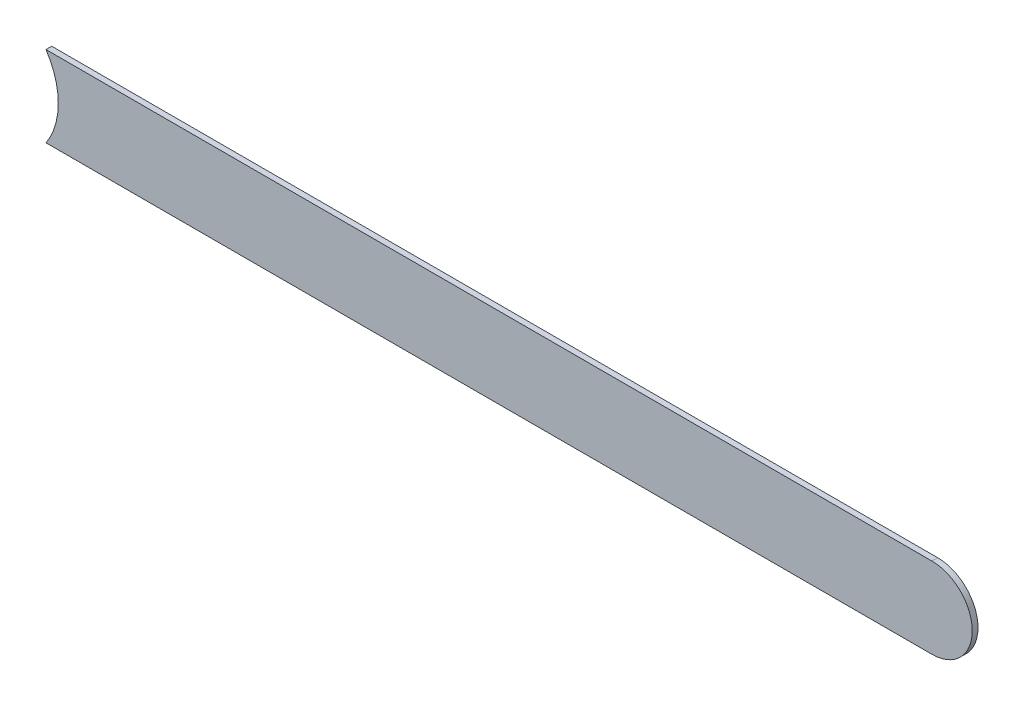
ISO-10303-21;
HEADER;
FILE_DESCRIPTION(('STEP AP214'),'2;1');
FILE_NAME('part.step','',(''),(''),'','','');
FILE_SCHEMA(('AUTOMOTIVE_DESIGN { 1 0 10303 214 1 1 1 1 }'));
ENDSEC;
DATA;
#1=APPLICATION_CONTEXT('core data for automotive mechanical design processes');
#2=APPLICATION_PROTOCOL_DEFINITION('international standard','automotive_design',2000,#1);
#3=PRODUCT_CONTEXT('',#1,'mechanical');
#4=PRODUCT('Part','Part','',(#3));
#5=PRODUCT_RELATED_PRODUCT_CATEGORY('part','',(#4));
#6=PRODUCT_DEFINITION_FORMATION('','',#4);
#7=PRODUCT_DEFINITION_CONTEXT('part definition',#1,'design');
#8=PRODUCT_DEFINITION('design','',#6,#7);
#9=PRODUCT_DEFINITION_SHAPE('','',#8);
#10=(LENGTH_UNIT() NAMED_UNIT(*) SI_UNIT(.MILLI.,.METRE.));
#11=(NAMED_UNIT(*) PLANE_ANGLE_UNIT() SI_UNIT($,.RADIAN.));
#12=(NAMED_UNIT(*) SI_UNIT($,.STERADIAN.) SOLID_ANGLE_UNIT());
#13=UNCERTAINTY_MEASURE_WITH_UNIT(LENGTH_MEASURE(1.E-05),#10,'distance_accuracy_value','');
#14=(GEOMETRIC_REPRESENTATION_CONTEXT(3) GLOBAL_UNCERTAINTY_ASSIGNED_CONTEXT((#13)) GLOBAL_UNIT_ASSIGNED_CONTEXT((#10,
#11,#12)) REPRESENTATION_CONTEXT('',''));
#15=CARTESIAN_POINT('',(0.,0.,0.));
#16=DIRECTION('',(0.,0.,1.));
#17=DIRECTION('',(1.,0.,0.));
#18=AXIS2_PLACEMENT_3D('',#15,#16,#17);
#19=CARTESIAN_POINT('',(94.2051685903459,101.5380113,0.));
#20=DIRECTION('',(0.,1.,0.));
#21=DIRECTION('',(1.,0.,0.));
#22=AXIS2_PLACEMENT_3D('',#19,#20,#21);
#23=PLANE('',#22);
#24=DIRECTION('',(1.,0.,0.));
#25=VECTOR('',#24,1.);
#26=CARTESIAN_POINT('',(93.8310036,101.5380113,0.03556));
#27=LINE('',#26,#25);
#28=CARTESIAN_POINT('',(94.2051685903459,101.5380113,0.03556));
#29=VERTEX_POINT('',#28);
#30=CARTESIAN_POINT('',(99.68801246,101.5380113,0.03556));
#31=VERTEX_POINT('',#30);
#32=EDGE_CURVE('E11',#29,#31,#27,.T.);
#33=ORIENTED_EDGE('',*,*,#32,.F.);
#34=DIRECTION('',(0.,0.,1.));
#35=VECTOR('',#34,1.);
#36=CARTESIAN_POINT('',(94.2051685903459,101.5380113,0.));
#37=LINE('',#36,#35);
#38=CARTESIAN_POINT('',(94.2051685903459,101.5380113,0.));
#39=VERTEX_POINT('',#38);
#40=EDGE_CURVE('E24',#39,#29,#37,.T.);
#41=ORIENTED_EDGE('',*,*,#40,.F.);
#42=DIRECTION('',(1.,0.,0.));
#43=VECTOR('',#42,1.);
#44=CARTESIAN_POINT('',(93.8310036,101.5380113,0.));
#45=LINE('',#44,#43);
#46=CARTESIAN_POINT('',(99.68801246,101.5380113,0.));
#47=VERTEX_POINT('',#46);
#48=EDGE_CURVE('E82',#39,#47,#45,.T.);
#49=ORIENTED_EDGE('',*,*,#48,.T.);
#50=DIRECTION('',(0.,0.,1.));
#51=VECTOR('',#50,1.);
#52=CARTESIAN_POINT('',(99.68801246,101.5380113,0.));
#53=LINE('',#52,#51);
#54=EDGE_CURVE('E37',#47,#31,#53,.T.);
#55=ORIENTED_EDGE('',*,*,#54,.T.);
#56=EDGE_LOOP('',(#33,#41,#49,#55));
#57=FACE_BOUND('',#56,.T.);
#58=ADVANCED_FACE('F17',(#57),#23,.F.);
#59=CARTESIAN_POINT('',(99.68801246,101.7880108,0.));
#60=DIRECTION('',(0.,0.,-1.));
#61=DIRECTION('',(0.,-1.,0.));
#62=AXIS2_PLACEMENT_3D('',#59,#60,#61);
#63=CYLINDRICAL_SURFACE('',#62,0.249999499999997);
#64=CARTESIAN_POINT('',(99.68801246,101.7880108,0.03556));
#65=DIRECTION('',(0.,0.,1.));
#66=DIRECTION('',(0.,-1.,0.));
#67=AXIS2_PLACEMENT_3D('',#64,#65,#66);
#68=CIRCLE('',#67,0.249999499999997);
#69=CARTESIAN_POINT('',(99.68801246,102.0380103,0.03556));
#70=VERTEX_POINT('',#69);
#71=EDGE_CURVE('E97',#31,#70,#68,.T.);
#72=ORIENTED_EDGE('',*,*,#71,.F.);
#73=ORIENTED_EDGE('',*,*,#54,.F.);
#74=CARTESIAN_POINT('',(99.68801246,101.7880108,0.));
#75=DIRECTION('',(0.,0.,1.));
#76=DIRECTION('',(0.,-1.,0.));
#77=AXIS2_PLACEMENT_3D('',#74,#75,#76);
#78=CIRCLE('',#77,0.249999499999997);
#79=CARTESIAN_POINT('',(99.68801246,102.0380103,0.));
#80=VERTEX_POINT('',#79);
#81=EDGE_CURVE('E94',#47,#80,#78,.T.);
#82=ORIENTED_EDGE('',*,*,#81,.T.);
#83=DIRECTION('',(0.,0.,1.));
#84=VECTOR('',#83,1.);
#85=CARTESIAN_POINT('',(99.68801246,102.0380103,0.));
#86=LINE('',#85,#84);
#87=EDGE_CURVE('E92',#80,#70,#86,.T.);
#88=ORIENTED_EDGE('',*,*,#87,.T.);
#89=EDGE_LOOP('',(#72,#73,#82,#88));
#90=FACE_BOUND('',#89,.T.);
#91=ADVANCED_FACE('F103',(#90),#63,.T.);
#92=CARTESIAN_POINT('',(99.68801246,102.0380103,0.));
#93=DIRECTION('',(0.,-1.,0.));
#94=DIRECTION('',(-1.,0.,0.));
#95=AXIS2_PLACEMENT_3D('',#92,#93,#94);
#96=PLANE('',#95);
#97=DIRECTION('',(-1.,0.,0.));
#98=VECTOR('',#97,1.);
#99=CARTESIAN_POINT('',(99.68801246,102.0380103,0.03556));
#100=LINE('',#99,#98);
#101=CARTESIAN_POINT('',(94.2051685903459,102.0380103,0.03556));
#102=VERTEX_POINT('',#101);
#103=EDGE_CURVE('E89',#70,#102,#100,.T.);
#104=ORIENTED_EDGE('',*,*,#103,.F.);
#105=ORIENTED_EDGE('',*,*,#87,.F.);
#106=DIRECTION('',(-1.,0.,0.));
#107=VECTOR('',#106,1.);
#108=CARTESIAN_POINT('',(99.68801246,102.0380103,0.));
#109=LINE('',#108,#107);
#110=CARTESIAN_POINT('',(94.2051685903459,102.0380103,0.));
#111=VERTEX_POINT('',#110);
#112=EDGE_CURVE('E87',#80,#111,#109,.T.);
#113=ORIENTED_EDGE('',*,*,#112,.T.);
#114=DIRECTION('',(0.,0.,1.));
#115=VECTOR('',#114,1.);
#116=CARTESIAN_POINT('',(94.2051685903459,102.0380103,0.));
#117=LINE('',#116,#115);
#118=EDGE_CURVE('E69',#111,#102,#117,.T.);
#119=ORIENTED_EDGE('',*,*,#118,.T.);
#120=EDGE_LOOP('',(#104,#105,#113,#119));
#121=FACE_BOUND('',#120,.T.);
#122=ADVANCED_FACE('F108',(#121),#96,.F.);
#123=CARTESIAN_POINT('',(93.8310036,101.7880108,0.));
#124=DIRECTION('',(0.,0.,-1.));
#125=DIRECTION('',(1.,0.,0.));
#126=AXIS2_PLACEMENT_3D('',#123,#124,#125);
#127=CYLINDRICAL_SURFACE('',#126,0.4499991);
#128=DIRECTION('',(0.,0.,1.));
#129=VECTOR('',#128,1.);
#130=CARTESIAN_POINT('',(94.2810027,101.7880108,0.));
#131=LINE('',#130,#129);
#132=CARTESIAN_POINT('',(94.2810027,101.7880108,0.));
#133=VERTEX_POINT('',#132);
#134=CARTESIAN_POINT('',(94.2810027,101.7880108,0.03556));
#135=VERTEX_POINT('',#134);
#136=EDGE_CURVE('E59',#133,#135,#131,.T.);
#137=ORIENTED_EDGE('',*,*,#136,.T.);
#138=CARTESIAN_POINT('',(93.8310036,101.7880108,0.03556));
#139=DIRECTION('',(0.,0.,1.));
#140=DIRECTION('',(1.,0.,0.));
#141=AXIS2_PLACEMENT_3D('',#138,#139,#140);
#142=CIRCLE('',#141,0.4499991);
#143=EDGE_CURVE('E70',#135,#102,#142,.T.);
#144=ORIENTED_EDGE('',*,*,#143,.T.);
#145=ORIENTED_EDGE('',*,*,#118,.F.);
#146=CARTESIAN_POINT('',(93.8310036,101.7880108,0.));
#147=DIRECTION('',(0.,0.,1.));
#148=DIRECTION('',(1.,0.,0.));
#149=AXIS2_PLACEMENT_3D('',#146,#147,#148);
#150=CIRCLE('',#149,0.4499991);
#151=EDGE_CURVE('E73',#133,#111,#150,.T.);
#152=ORIENTED_EDGE('',*,*,#151,.F.);
#153=EDGE_LOOP('',(#137,#144,#145,#152));
#154=FACE_BOUND('',#153,.T.);
#155=ADVANCED_FACE('F74',(#154),#127,.F.);
#156=CARTESIAN_POINT('',(93.8310036,101.7880108,0.));
#157=DIRECTION('',(0.,0.,-1.));
#158=DIRECTION('',(1.,0.,0.));
#159=AXIS2_PLACEMENT_3D('',#156,#157,#158);
#160=CYLINDRICAL_SURFACE('',#159,0.4499991);
#161=ORIENTED_EDGE('',*,*,#40,.T.);
#162=CARTESIAN_POINT('',(93.8310036,101.7880108,0.03556));
#163=DIRECTION('',(0.,0.,1.));
#164=DIRECTION('',(1.,0.,0.));
#165=AXIS2_PLACEMENT_3D('',#162,#163,#164);
#166=CIRCLE('',#165,0.4499991);
#167=EDGE_CURVE('E65',#29,#135,#166,.T.);
#168=ORIENTED_EDGE('',*,*,#167,.T.);
#169=ORIENTED_EDGE('',*,*,#136,.F.);
#170=EDGE_CURVE('E63',#39,#133,#150,.T.);
#171=ORIENTED_EDGE('',*,*,#170,.F.);
#172=EDGE_LOOP('',(#161,#168,#169,#171));
#173=FACE_BOUND('',#172,.T.);
#174=ADVANCED_FACE('F61',(#173),#160,.F.);
#175=CARTESIAN_POINT('',(93.8310036,101.5380113,0.));
#176=DIRECTION('',(0.,0.,-1.));
#177=DIRECTION('',(-1.,0.,0.));
#178=AXIS2_PLACEMENT_3D('',#175,#176,#177);
#179=PLANE('',#178);
#180=ORIENTED_EDGE('',*,*,#48,.F.);
#181=ORIENTED_EDGE('',*,*,#170,.T.);
#182=ORIENTED_EDGE('',*,*,#151,.T.);
#183=ORIENTED_EDGE('',*,*,#112,.F.);
#184=ORIENTED_EDGE('',*,*,#81,.F.);
#185=EDGE_LOOP('',(#180,#181,#182,#183,#184));
#186=FACE_BOUND('',#185,.T.);
#187=ADVANCED_FACE('F80',(#186),#179,.T.);
#188=CARTESIAN_POINT('',(93.8310036,101.5380113,0.03556));
#189=DIRECTION('',(0.,0.,-1.));
#190=DIRECTION('',(-1.,0.,0.));
#191=AXIS2_PLACEMENT_3D('',#188,#189,#190);
#192=PLANE('',#191);
#193=ORIENTED_EDGE('',*,*,#167,.F.);
#194=ORIENTED_EDGE('',*,*,#32,.T.);
#195=ORIENTED_EDGE('',*,*,#71,.T.);
#196=ORIENTED_EDGE('',*,*,#103,.T.);
#197=ORIENTED_EDGE('',*,*,#143,.F.);
#198=EDGE_LOOP('',(#193,#194,#195,#196,#197));
#199=FACE_BOUND('',#198,.T.);
#200=ADVANCED_FACE('F106',(#199),#192,.F.);
#201=CLOSED_SHELL('',(#58,#91,#122,#155,#174,#187,#200));
#202=MANIFOLD_SOLID_BREP('B1',#201);
#203=ADVANCED_BREP_SHAPE_REPRESENTATION('',(#18,#202),#14);
#204=SHAPE_DEFINITION_REPRESENTATION(#9,#203);
ENDSEC;
END-ISO-10303-21;
